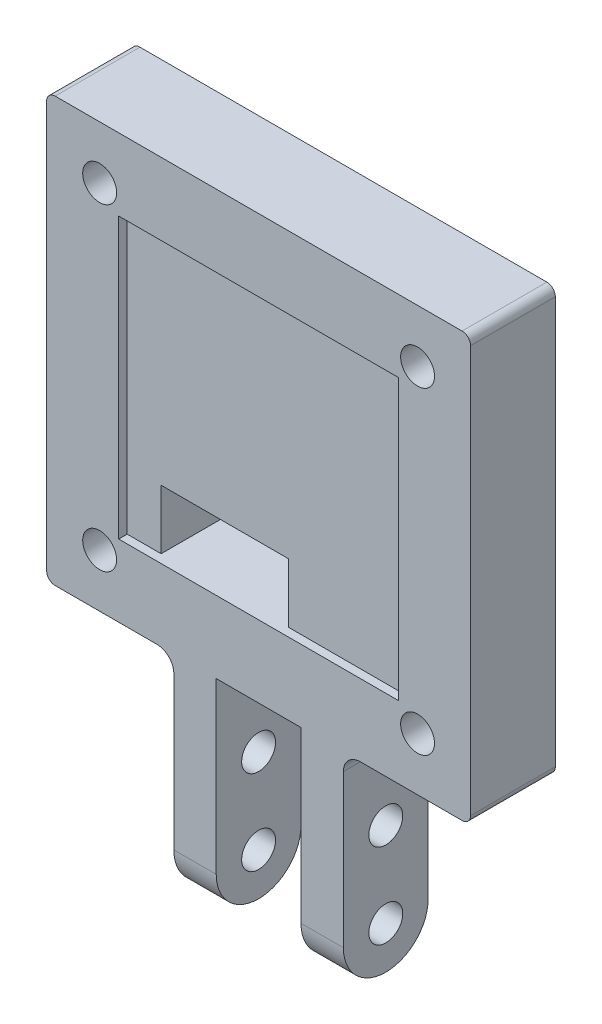
ISO-10303-21;
HEADER;
FILE_DESCRIPTION(('STEP AP214'),'2;1');
FILE_NAME('part.step','',(''),(''),'','','');
FILE_SCHEMA(('AUTOMOTIVE_DESIGN { 1 0 10303 214 1 1 1 1 }'));
ENDSEC;
DATA;
#1=APPLICATION_CONTEXT('core data for automotive mechanical design processes');
#2=APPLICATION_PROTOCOL_DEFINITION('international standard','automotive_design',2000,#1);
#3=PRODUCT_CONTEXT('',#1,'mechanical');
#4=PRODUCT('Part','Part','',(#3));
#5=PRODUCT_RELATED_PRODUCT_CATEGORY('part','',(#4));
#6=PRODUCT_DEFINITION_FORMATION('','',#4);
#7=PRODUCT_DEFINITION_CONTEXT('part definition',#1,'design');
#8=PRODUCT_DEFINITION('design','',#6,#7);
#9=PRODUCT_DEFINITION_SHAPE('','',#8);
#10=(LENGTH_UNIT() NAMED_UNIT(*) SI_UNIT(.MILLI.,.METRE.));
#11=(NAMED_UNIT(*) PLANE_ANGLE_UNIT() SI_UNIT($,.RADIAN.));
#12=(NAMED_UNIT(*) SI_UNIT($,.STERADIAN.) SOLID_ANGLE_UNIT());
#13=UNCERTAINTY_MEASURE_WITH_UNIT(LENGTH_MEASURE(1.E-05),#10,'distance_accuracy_value','');
#14=(GEOMETRIC_REPRESENTATION_CONTEXT(3) GLOBAL_UNCERTAINTY_ASSIGNED_CONTEXT((#13)) GLOBAL_UNIT_ASSIGNED_CONTEXT((#10,
#11,#12)) REPRESENTATION_CONTEXT('',''));
#15=CARTESIAN_POINT('',(0.,0.,0.));
#16=DIRECTION('',(0.,0.,1.));
#17=DIRECTION('',(1.,0.,0.));
#18=AXIS2_PLACEMENT_3D('',#15,#16,#17);
#19=CARTESIAN_POINT('',(0.,0.,9.));
#20=DIRECTION('',(0.,0.,-1.));
#21=DIRECTION('',(-1.,0.,0.));
#22=AXIS2_PLACEMENT_3D('',#19,#20,#21);
#23=PLANE('',#22);
#24=DIRECTION('',(0.,-1.,0.));
#25=VECTOR('',#24,1.);
#26=CARTESIAN_POINT('',(12.5,8.5,9.));
#27=LINE('',#26,#25);
#28=CARTESIAN_POINT('',(12.5,15.5,9.));
#29=VERTEX_POINT('',#28);
#30=CARTESIAN_POINT('',(12.5,8.5,9.));
#31=VERTEX_POINT('',#30);
#32=EDGE_CURVE('E235',#29,#31,#27,.T.);
#33=ORIENTED_EDGE('',*,*,#32,.F.);
#34=DIRECTION('',(-1.,0.,0.));
#35=VECTOR('',#34,1.);
#36=CARTESIAN_POINT('',(12.5,15.5,9.));
#37=LINE('',#36,#35);
#38=CARTESIAN_POINT('',(27.5,15.5,9.));
#39=VERTEX_POINT('',#38);
#40=EDGE_CURVE('E232',#39,#29,#37,.T.);
#41=ORIENTED_EDGE('',*,*,#40,.F.);
#42=DIRECTION('',(0.,1.,0.));
#43=VECTOR('',#42,1.);
#44=CARTESIAN_POINT('',(27.5,8.5,9.));
#45=LINE('',#44,#43);
#46=CARTESIAN_POINT('',(27.5,8.5,9.));
#47=VERTEX_POINT('',#46);
#48=EDGE_CURVE('E53',#47,#39,#45,.T.);
#49=ORIENTED_EDGE('',*,*,#48,.F.);
#50=DIRECTION('',(1.,0.,0.));
#51=VECTOR('',#50,1.);
#52=CARTESIAN_POINT('',(8.49999999999999,8.5,9.));
#53=LINE('',#52,#51);
#54=CARTESIAN_POINT('',(41.5,8.5,9.));
#55=VERTEX_POINT('',#54);
#56=EDGE_CURVE('E248',#47,#55,#53,.T.);
#57=ORIENTED_EDGE('',*,*,#56,.T.);
#58=DIRECTION('',(0.,1.,0.));
#59=VECTOR('',#58,1.);
#60=CARTESIAN_POINT('',(41.5,8.5,9.));
#61=LINE('',#60,#59);
#62=CARTESIAN_POINT('',(41.5,41.5,9.));
#63=VERTEX_POINT('',#62);
#64=EDGE_CURVE('E266',#55,#63,#61,.T.);
#65=ORIENTED_EDGE('',*,*,#64,.T.);
#66=DIRECTION('',(-1.,0.,0.));
#67=VECTOR('',#66,1.);
#68=CARTESIAN_POINT('',(8.49999999999999,41.5,9.));
#69=LINE('',#68,#67);
#70=CARTESIAN_POINT('',(8.49999999999999,41.5,9.));
#71=VERTEX_POINT('',#70);
#72=EDGE_CURVE('E479',#63,#71,#69,.T.);
#73=ORIENTED_EDGE('',*,*,#72,.T.);
#74=DIRECTION('',(0.,-1.,0.));
#75=VECTOR('',#74,1.);
#76=CARTESIAN_POINT('',(8.49999999999999,8.5,9.));
#77=LINE('',#76,#75);
#78=CARTESIAN_POINT('',(8.49999999999999,8.5,9.));
#79=VERTEX_POINT('',#78);
#80=EDGE_CURVE('E246',#71,#79,#77,.T.);
#81=ORIENTED_EDGE('',*,*,#80,.T.);
#82=EDGE_CURVE('E228',#79,#31,#53,.T.);
#83=ORIENTED_EDGE('',*,*,#82,.T.);
#84=EDGE_LOOP('',(#33,#41,#49,#57,#65,#73,#81,#83));
#85=FACE_BOUND('',#84,.T.);
#86=ADVANCED_FACE('F38',(#85),#23,.F.);
#87=CARTESIAN_POINT('',(0.,0.,10.));
#88=DIRECTION('',(0.,1.,0.));
#89=DIRECTION('',(0.,0.,1.));
#90=AXIS2_PLACEMENT_3D('',#87,#88,#89);
#91=PLANE('',#90);
#92=DIRECTION('',(0.,0.,-1.));
#93=VECTOR('',#92,1.);
#94=CARTESIAN_POINT('',(30.,0.,10.));
#95=LINE('',#94,#93);
#96=CARTESIAN_POINT('',(30.,0.,10.));
#97=VERTEX_POINT('',#96);
#98=CARTESIAN_POINT('',(30.,0.,0.));
#99=VERTEX_POINT('',#98);
#100=EDGE_CURVE('E310',#97,#99,#95,.T.);
#101=ORIENTED_EDGE('',*,*,#100,.F.);
#102=DIRECTION('',(1.,0.,0.));
#103=VECTOR('',#102,1.);
#104=CARTESIAN_POINT('',(0.,0.,10.));
#105=LINE('',#104,#103);
#106=CARTESIAN_POINT('',(20.,0.,10.));
#107=VERTEX_POINT('',#106);
#108=EDGE_CURVE('E347',#107,#97,#105,.T.);
#109=ORIENTED_EDGE('',*,*,#108,.F.);
#110=DIRECTION('',(0.,0.,1.));
#111=VECTOR('',#110,1.);
#112=CARTESIAN_POINT('',(20.,0.,0.));
#113=LINE('',#112,#111);
#114=CARTESIAN_POINT('',(20.,0.,0.));
#115=VERTEX_POINT('',#114);
#116=EDGE_CURVE('E324',#115,#107,#113,.T.);
#117=ORIENTED_EDGE('',*,*,#116,.F.);
#118=DIRECTION('',(1.,0.,0.));
#119=VECTOR('',#118,1.);
#120=CARTESIAN_POINT('',(0.,0.,0.));
#121=LINE('',#120,#119);
#122=EDGE_CURVE('E361',#115,#99,#121,.T.);
#123=ORIENTED_EDGE('',*,*,#122,.T.);
#124=EDGE_LOOP('',(#101,#109,#117,#123));
#125=FACE_BOUND('',#124,.T.);
#126=ADVANCED_FACE('F509',(#125),#91,.F.);
#127=CARTESIAN_POINT('',(37.,0.,10.));
#128=VERTEX_POINT('',#127);
#129=CARTESIAN_POINT('',(49.,0.,10.));
#130=VERTEX_POINT('',#129);
#131=EDGE_CURVE('E341',#128,#130,#105,.T.);
#132=ORIENTED_EDGE('',*,*,#131,.F.);
#133=DIRECTION('',(0.,0.,1.));
#134=VECTOR('',#133,1.);
#135=CARTESIAN_POINT('',(37.,0.,0.));
#136=LINE('',#135,#134);
#137=CARTESIAN_POINT('',(37.,0.,0.));
#138=VERTEX_POINT('',#137);
#139=EDGE_CURVE('E456',#128,#138,#136,.F.);
#140=ORIENTED_EDGE('',*,*,#139,.T.);
#141=CARTESIAN_POINT('',(49.,0.,0.));
#142=VERTEX_POINT('',#141);
#143=EDGE_CURVE('E356',#138,#142,#121,.T.);
#144=ORIENTED_EDGE('',*,*,#143,.T.);
#145=DIRECTION('',(0.,0.,-1.));
#146=VECTOR('',#145,1.);
#147=CARTESIAN_POINT('',(49.,0.,10.));
#148=LINE('',#147,#146);
#149=EDGE_CURVE('E420',#142,#130,#148,.F.);
#150=ORIENTED_EDGE('',*,*,#149,.T.);
#151=EDGE_LOOP('',(#132,#140,#144,#150));
#152=FACE_BOUND('',#151,.T.);
#153=ADVANCED_FACE('F516',(#152),#91,.F.);
#154=CARTESIAN_POINT('',(1.,0.,0.));
#155=VERTEX_POINT('',#154);
#156=CARTESIAN_POINT('',(13.,0.,0.));
#157=VERTEX_POINT('',#156);
#158=EDGE_CURVE('E357',#155,#157,#121,.T.);
#159=ORIENTED_EDGE('',*,*,#158,.T.);
#160=DIRECTION('',(0.,0.,-1.));
#161=VECTOR('',#160,1.);
#162=CARTESIAN_POINT('',(13.,0.,10.));
#163=LINE('',#162,#161);
#164=CARTESIAN_POINT('',(13.,0.,10.));
#165=VERTEX_POINT('',#164);
#166=EDGE_CURVE('E447',#157,#165,#163,.F.);
#167=ORIENTED_EDGE('',*,*,#166,.T.);
#168=CARTESIAN_POINT('',(1.,0.,10.));
#169=VERTEX_POINT('',#168);
#170=EDGE_CURVE('E343',#169,#165,#105,.T.);
#171=ORIENTED_EDGE('',*,*,#170,.F.);
#172=DIRECTION('',(0.,0.,-1.));
#173=VECTOR('',#172,1.);
#174=CARTESIAN_POINT('',(1.,0.,10.));
#175=LINE('',#174,#173);
#176=EDGE_CURVE('E431',#169,#155,#175,.T.);
#177=ORIENTED_EDGE('',*,*,#176,.T.);
#178=EDGE_LOOP('',(#159,#167,#171,#177));
#179=FACE_BOUND('',#178,.T.);
#180=ADVANCED_FACE('F519',(#179),#91,.F.);
#181=CARTESIAN_POINT('',(0.,50.,10.));
#182=DIRECTION('',(1.,0.,0.));
#183=DIRECTION('',(0.,0.,-1.));
#184=AXIS2_PLACEMENT_3D('',#181,#182,#183);
#185=PLANE('',#184);
#186=DIRECTION('',(0.,-1.,0.));
#187=VECTOR('',#186,1.);
#188=CARTESIAN_POINT('',(0.,50.,0.));
#189=LINE('',#188,#187);
#190=CARTESIAN_POINT('',(0.,49.,0.));
#191=VERTEX_POINT('',#190);
#192=CARTESIAN_POINT('',(0.,1.,0.));
#193=VERTEX_POINT('',#192);
#194=EDGE_CURVE('E337',#191,#193,#189,.T.);
#195=ORIENTED_EDGE('',*,*,#194,.T.);
#196=DIRECTION('',(0.,0.,-1.));
#197=VECTOR('',#196,1.);
#198=CARTESIAN_POINT('',(0.,1.,10.));
#199=LINE('',#198,#197);
#200=CARTESIAN_POINT('',(0.,1.,10.));
#201=VERTEX_POINT('',#200);
#202=EDGE_CURVE('E437',#193,#201,#199,.F.);
#203=ORIENTED_EDGE('',*,*,#202,.T.);
#204=DIRECTION('',(0.,-1.,0.));
#205=VECTOR('',#204,1.);
#206=CARTESIAN_POINT('',(0.,50.,10.));
#207=LINE('',#206,#205);
#208=CARTESIAN_POINT('',(0.,49.,10.));
#209=VERTEX_POINT('',#208);
#210=EDGE_CURVE('E338',#209,#201,#207,.T.);
#211=ORIENTED_EDGE('',*,*,#210,.F.);
#212=DIRECTION('',(0.,0.,-1.));
#213=VECTOR('',#212,1.);
#214=CARTESIAN_POINT('',(0.,49.,10.));
#215=LINE('',#214,#213);
#216=EDGE_CURVE('E434',#209,#191,#215,.T.);
#217=ORIENTED_EDGE('',*,*,#216,.T.);
#218=EDGE_LOOP('',(#195,#203,#211,#217));
#219=FACE_BOUND('',#218,.T.);
#220=ADVANCED_FACE('F769',(#219),#185,.F.);
#221=CARTESIAN_POINT('',(50.,0.,10.));
#222=DIRECTION('',(-1.,0.,0.));
#223=DIRECTION('',(0.,-1.,0.));
#224=AXIS2_PLACEMENT_3D('',#221,#222,#223);
#225=PLANE('',#224);
#226=DIRECTION('',(0.,1.,0.));
#227=VECTOR('',#226,1.);
#228=CARTESIAN_POINT('',(50.,0.,10.));
#229=LINE('',#228,#227);
#230=CARTESIAN_POINT('',(50.,1.,10.));
#231=VERTEX_POINT('',#230);
#232=CARTESIAN_POINT('',(50.,49.,10.));
#233=VERTEX_POINT('',#232);
#234=EDGE_CURVE('E346',#231,#233,#229,.T.);
#235=ORIENTED_EDGE('',*,*,#234,.F.);
#236=DIRECTION('',(0.,0.,-1.));
#237=VECTOR('',#236,1.);
#238=CARTESIAN_POINT('',(50.,1.,10.));
#239=LINE('',#238,#237);
#240=CARTESIAN_POINT('',(50.,1.,0.));
#241=VERTEX_POINT('',#240);
#242=EDGE_CURVE('E408',#231,#241,#239,.T.);
#243=ORIENTED_EDGE('',*,*,#242,.T.);
#244=DIRECTION('',(0.,1.,0.));
#245=VECTOR('',#244,1.);
#246=CARTESIAN_POINT('',(50.,0.,0.));
#247=LINE('',#246,#245);
#248=CARTESIAN_POINT('',(50.,49.,0.));
#249=VERTEX_POINT('',#248);
#250=EDGE_CURVE('E360',#241,#249,#247,.T.);
#251=ORIENTED_EDGE('',*,*,#250,.T.);
#252=DIRECTION('',(0.,0.,-1.));
#253=VECTOR('',#252,1.);
#254=CARTESIAN_POINT('',(50.,49.,10.));
#255=LINE('',#254,#253);
#256=EDGE_CURVE('E404',#249,#233,#255,.F.);
#257=ORIENTED_EDGE('',*,*,#256,.T.);
#258=EDGE_LOOP('',(#235,#243,#251,#257));
#259=FACE_BOUND('',#258,.T.);
#260=ADVANCED_FACE('F764',(#259),#225,.F.);
#261=CARTESIAN_POINT('',(50.,50.,10.));
#262=DIRECTION('',(0.,-1.,0.));
#263=DIRECTION('',(1.,0.,0.));
#264=AXIS2_PLACEMENT_3D('',#261,#262,#263);
#265=PLANE('',#264);
#266=DIRECTION('',(-1.,0.,0.));
#267=VECTOR('',#266,1.);
#268=CARTESIAN_POINT('',(50.,50.,0.));
#269=LINE('',#268,#267);
#270=CARTESIAN_POINT('',(49.,50.,0.));
#271=VERTEX_POINT('',#270);
#272=CARTESIAN_POINT('',(1.,50.,0.));
#273=VERTEX_POINT('',#272);
#274=EDGE_CURVE('E342',#271,#273,#269,.T.);
#275=ORIENTED_EDGE('',*,*,#274,.T.);
#276=DIRECTION('',(0.,0.,-1.));
#277=VECTOR('',#276,1.);
#278=CARTESIAN_POINT('',(1.,50.,10.));
#279=LINE('',#278,#277);
#280=CARTESIAN_POINT('',(1.,50.,10.));
#281=VERTEX_POINT('',#280);
#282=EDGE_CURVE('E442',#273,#281,#279,.F.);
#283=ORIENTED_EDGE('',*,*,#282,.T.);
#284=DIRECTION('',(-1.,0.,0.));
#285=VECTOR('',#284,1.);
#286=CARTESIAN_POINT('',(50.,50.,10.));
#287=LINE('',#286,#285);
#288=CARTESIAN_POINT('',(49.,50.,10.));
#289=VERTEX_POINT('',#288);
#290=EDGE_CURVE('E350',#289,#281,#287,.T.);
#291=ORIENTED_EDGE('',*,*,#290,.F.);
#292=DIRECTION('',(0.,0.,-1.));
#293=VECTOR('',#292,1.);
#294=CARTESIAN_POINT('',(49.,50.,10.));
#295=LINE('',#294,#293);
#296=EDGE_CURVE('E439',#289,#271,#295,.T.);
#297=ORIENTED_EDGE('',*,*,#296,.T.);
#298=EDGE_LOOP('',(#275,#283,#291,#297));
#299=FACE_BOUND('',#298,.T.);
#300=ADVANCED_FACE('F744',(#299),#265,.F.);
#301=CARTESIAN_POINT('',(0.,0.,10.));
#302=DIRECTION('',(0.,0.,1.));
#303=DIRECTION('',(1.,0.,0.));
#304=AXIS2_PLACEMENT_3D('',#301,#302,#303);
#305=PLANE('',#304);
#306=DIRECTION('',(0.,1.,0.));
#307=VECTOR('',#306,1.);
#308=CARTESIAN_POINT('',(41.5,8.5,10.));
#309=LINE('',#308,#307);
#310=CARTESIAN_POINT('',(41.5,8.5,10.));
#311=VERTEX_POINT('',#310);
#312=CARTESIAN_POINT('',(41.5,41.5,10.));
#313=VERTEX_POINT('',#312);
#314=EDGE_CURVE('E256',#311,#313,#309,.T.);
#315=ORIENTED_EDGE('',*,*,#314,.F.);
#316=DIRECTION('',(1.,0.,0.));
#317=VECTOR('',#316,1.);
#318=CARTESIAN_POINT('',(8.49999999999999,8.5,10.));
#319=LINE('',#318,#317);
#320=CARTESIAN_POINT('',(8.49999999999999,8.5,10.));
#321=VERTEX_POINT('',#320);
#322=EDGE_CURVE('E264',#321,#311,#319,.T.);
#323=ORIENTED_EDGE('',*,*,#322,.F.);
#324=DIRECTION('',(0.,-1.,0.));
#325=VECTOR('',#324,1.);
#326=CARTESIAN_POINT('',(8.49999999999999,8.5,10.));
#327=LINE('',#326,#325);
#328=CARTESIAN_POINT('',(8.49999999999999,41.5,10.));
#329=VERTEX_POINT('',#328);
#330=EDGE_CURVE('E261',#329,#321,#327,.T.);
#331=ORIENTED_EDGE('',*,*,#330,.F.);
#332=DIRECTION('',(-1.,0.,0.));
#333=VECTOR('',#332,1.);
#334=CARTESIAN_POINT('',(8.49999999999999,41.5,10.));
#335=LINE('',#334,#333);
#336=EDGE_CURVE('E258',#313,#329,#335,.T.);
#337=ORIENTED_EDGE('',*,*,#336,.F.);
#338=EDGE_LOOP('',(#315,#323,#331,#337));
#339=FACE_BOUND('',#338,.T.);
#340=CARTESIAN_POINT('',(43.75,6.25,10.));
#341=DIRECTION('',(0.,0.,1.));
#342=DIRECTION('',(1.,0.,0.));
#343=AXIS2_PLACEMENT_3D('',#340,#341,#342);
#344=CIRCLE('',#343,2.);
#345=CARTESIAN_POINT('',(45.75,6.25,10.));
#346=VERTEX_POINT('',#345);
#347=EDGE_CURVE('E297',#346,#346,#344,.T.);
#348=ORIENTED_EDGE('',*,*,#347,.F.);
#349=EDGE_LOOP('',(#348));
#350=FACE_BOUND('',#349,.T.);
#351=CARTESIAN_POINT('',(6.25,6.25,10.));
#352=DIRECTION('',(0.,0.,1.));
#353=DIRECTION('',(1.,0.,0.));
#354=AXIS2_PLACEMENT_3D('',#351,#352,#353);
#355=CIRCLE('',#354,2.);
#356=CARTESIAN_POINT('',(8.25,6.25,10.));
#357=VERTEX_POINT('',#356);
#358=EDGE_CURVE('E302',#357,#357,#355,.T.);
#359=ORIENTED_EDGE('',*,*,#358,.F.);
#360=EDGE_LOOP('',(#359));
#361=FACE_BOUND('',#360,.T.);
#362=CARTESIAN_POINT('',(6.25,43.75,10.));
#363=DIRECTION('',(0.,0.,1.));
#364=DIRECTION('',(1.,0.,0.));
#365=AXIS2_PLACEMENT_3D('',#362,#363,#364);
#366=CIRCLE('',#365,2.);
#367=CARTESIAN_POINT('',(8.25,43.75,10.));
#368=VERTEX_POINT('',#367);
#369=EDGE_CURVE('E298',#368,#368,#366,.T.);
#370=ORIENTED_EDGE('',*,*,#369,.F.);
#371=EDGE_LOOP('',(#370));
#372=FACE_BOUND('',#371,.T.);
#373=CARTESIAN_POINT('',(43.75,43.75,10.));
#374=DIRECTION('',(0.,0.,1.));
#375=DIRECTION('',(1.,0.,0.));
#376=AXIS2_PLACEMENT_3D('',#373,#374,#375);
#377=CIRCLE('',#376,2.);
#378=CARTESIAN_POINT('',(45.75,43.75,10.));
#379=VERTEX_POINT('',#378);
#380=EDGE_CURVE('E301',#379,#379,#377,.T.);
#381=ORIENTED_EDGE('',*,*,#380,.F.);
#382=EDGE_LOOP('',(#381));
#383=FACE_BOUND('',#382,.T.);
#384=DIRECTION('',(0.,1.,0.));
#385=VECTOR('',#384,1.);
#386=CARTESIAN_POINT('',(35.,-25.,10.));
#387=LINE('',#386,#385);
#388=CARTESIAN_POINT('',(35.,-20.,10.));
#389=VERTEX_POINT('',#388);
#390=CARTESIAN_POINT('',(35.,-2.,10.));
#391=VERTEX_POINT('',#390);
#392=EDGE_CURVE('E313',#389,#391,#387,.T.);
#393=ORIENTED_EDGE('',*,*,#392,.T.);
#394=CARTESIAN_POINT('',(37.,-2.,10.));
#395=DIRECTION('',(0.,0.,1.));
#396=DIRECTION('',(1.,0.,0.));
#397=AXIS2_PLACEMENT_3D('',#394,#395,#396);
#398=CIRCLE('',#397,2.);
#399=EDGE_CURVE('E458',#391,#128,#398,.F.);
#400=ORIENTED_EDGE('',*,*,#399,.T.);
#401=ORIENTED_EDGE('',*,*,#131,.T.);
#402=CARTESIAN_POINT('',(49.,1.,10.));
#403=DIRECTION('',(0.,0.,1.));
#404=DIRECTION('',(1.,0.,0.));
#405=AXIS2_PLACEMENT_3D('',#402,#403,#404);
#406=CIRCLE('',#405,1.);
#407=EDGE_CURVE('E429',#130,#231,#406,.T.);
#408=ORIENTED_EDGE('',*,*,#407,.T.);
#409=ORIENTED_EDGE('',*,*,#234,.T.);
#410=CARTESIAN_POINT('',(49.,49.,10.));
#411=DIRECTION('',(0.,0.,1.));
#412=DIRECTION('',(1.,0.,0.));
#413=AXIS2_PLACEMENT_3D('',#410,#411,#412);
#414=CIRCLE('',#413,1.);
#415=EDGE_CURVE('E423',#233,#289,#414,.T.);
#416=ORIENTED_EDGE('',*,*,#415,.T.);
#417=ORIENTED_EDGE('',*,*,#290,.T.);
#418=CARTESIAN_POINT('',(1.,49.,10.));
#419=DIRECTION('',(0.,0.,1.));
#420=DIRECTION('',(1.,0.,0.));
#421=AXIS2_PLACEMENT_3D('',#418,#419,#420);
#422=CIRCLE('',#421,1.);
#423=EDGE_CURVE('E425',#281,#209,#422,.T.);
#424=ORIENTED_EDGE('',*,*,#423,.T.);
#425=ORIENTED_EDGE('',*,*,#210,.T.);
#426=CARTESIAN_POINT('',(1.,1.,10.));
#427=DIRECTION('',(0.,0.,1.));
#428=DIRECTION('',(1.,0.,0.));
#429=AXIS2_PLACEMENT_3D('',#426,#427,#428);
#430=CIRCLE('',#429,1.);
#431=EDGE_CURVE('E427',#201,#169,#430,.T.);
#432=ORIENTED_EDGE('',*,*,#431,.T.);
#433=ORIENTED_EDGE('',*,*,#170,.T.);
#434=CARTESIAN_POINT('',(13.,-2.,10.));
#435=DIRECTION('',(0.,0.,1.));
#436=DIRECTION('',(1.,0.,0.));
#437=AXIS2_PLACEMENT_3D('',#434,#435,#436);
#438=CIRCLE('',#437,2.);
#439=CARTESIAN_POINT('',(15.,-2.,10.));
#440=VERTEX_POINT('',#439);
#441=EDGE_CURVE('E451',#165,#440,#438,.F.);
#442=ORIENTED_EDGE('',*,*,#441,.T.);
#443=DIRECTION('',(0.,1.,0.));
#444=VECTOR('',#443,1.);
#445=CARTESIAN_POINT('',(15.,-25.,10.));
#446=LINE('',#445,#444);
#447=CARTESIAN_POINT('',(15.,-20.,10.));
#448=VERTEX_POINT('',#447);
#449=EDGE_CURVE('E334',#448,#440,#446,.T.);
#450=ORIENTED_EDGE('',*,*,#449,.F.);
#451=DIRECTION('',(-1.,0.,0.));
#452=VECTOR('',#451,1.);
#453=CARTESIAN_POINT('',(0.,-20.,10.));
#454=LINE('',#453,#452);
#455=CARTESIAN_POINT('',(20.,-20.,10.));
#456=VERTEX_POINT('',#455);
#457=EDGE_CURVE('E389',#448,#456,#454,.F.);
#458=ORIENTED_EDGE('',*,*,#457,.T.);
#459=DIRECTION('',(0.,1.,0.));
#460=VECTOR('',#459,1.);
#461=CARTESIAN_POINT('',(20.,-25.,10.));
#462=LINE('',#461,#460);
#463=EDGE_CURVE('E327',#456,#107,#462,.T.);
#464=ORIENTED_EDGE('',*,*,#463,.T.);
#465=ORIENTED_EDGE('',*,*,#108,.T.);
#466=DIRECTION('',(0.,1.,0.));
#467=VECTOR('',#466,1.);
#468=CARTESIAN_POINT('',(30.,-25.,10.));
#469=LINE('',#468,#467);
#470=CARTESIAN_POINT('',(30.,-20.,10.));
#471=VERTEX_POINT('',#470);
#472=EDGE_CURVE('E322',#471,#97,#469,.T.);
#473=ORIENTED_EDGE('',*,*,#472,.F.);
#474=DIRECTION('',(-1.,0.,0.));
#475=VECTOR('',#474,1.);
#476=CARTESIAN_POINT('',(35.,-20.,10.));
#477=LINE('',#476,#475);
#478=EDGE_CURVE('E380',#471,#389,#477,.F.);
#479=ORIENTED_EDGE('',*,*,#478,.T.);
#480=EDGE_LOOP('',(#393,#400,#401,#408,#409,#416,#417,#424,#425,#432,#433,#442,#450,#458,#464,
#465,#473,#479));
#481=FACE_BOUND('',#480,.T.);
#482=ADVANCED_FACE('F492',(#339,#350,#361,#372,#383,#481),#305,.T.);
#483=CARTESIAN_POINT('',(0.,0.,0.));
#484=DIRECTION('',(0.,0.,1.));
#485=DIRECTION('',(1.,0.,0.));
#486=AXIS2_PLACEMENT_3D('',#483,#484,#485);
#487=PLANE('',#486);
#488=DIRECTION('',(-1.,0.,0.));
#489=VECTOR('',#488,1.);
#490=CARTESIAN_POINT('',(0.,15.5,0.));
#491=LINE('',#490,#489);
#492=CARTESIAN_POINT('',(27.5,15.5,0.));
#493=VERTEX_POINT('',#492);
#494=CARTESIAN_POINT('',(12.5,15.5,0.));
#495=VERTEX_POINT('',#494);
#496=EDGE_CURVE('E46',#493,#495,#491,.T.);
#497=ORIENTED_EDGE('',*,*,#496,.T.);
#498=DIRECTION('',(0.,-1.,0.));
#499=VECTOR('',#498,1.);
#500=CARTESIAN_POINT('',(12.5,0.,0.));
#501=LINE('',#500,#499);
#502=CARTESIAN_POINT('',(12.5,8.5,0.));
#503=VERTEX_POINT('',#502);
#504=EDGE_CURVE('E11',#495,#503,#501,.T.);
#505=ORIENTED_EDGE('',*,*,#504,.T.);
#506=DIRECTION('',(1.,0.,0.));
#507=VECTOR('',#506,1.);
#508=CARTESIAN_POINT('',(0.,8.5,0.));
#509=LINE('',#508,#507);
#510=CARTESIAN_POINT('',(27.5,8.5,0.));
#511=VERTEX_POINT('',#510);
#512=EDGE_CURVE('E230',#503,#511,#509,.T.);
#513=ORIENTED_EDGE('',*,*,#512,.T.);
#514=DIRECTION('',(0.,1.,0.));
#515=VECTOR('',#514,1.);
#516=CARTESIAN_POINT('',(27.5,0.,0.));
#517=LINE('',#516,#515);
#518=EDGE_CURVE('E463',#511,#493,#517,.T.);
#519=ORIENTED_EDGE('',*,*,#518,.T.);
#520=EDGE_LOOP('',(#497,#505,#513,#519));
#521=FACE_BOUND('',#520,.T.);
#522=CARTESIAN_POINT('',(43.75,6.25,0.));
#523=DIRECTION('',(0.,0.,1.));
#524=DIRECTION('',(1.,0.,0.));
#525=AXIS2_PLACEMENT_3D('',#522,#523,#524);
#526=CIRCLE('',#525,2.);
#527=CARTESIAN_POINT('',(45.75,6.25,0.));
#528=VERTEX_POINT('',#527);
#529=EDGE_CURVE('E314',#528,#528,#526,.T.);
#530=ORIENTED_EDGE('',*,*,#529,.T.);
#531=EDGE_LOOP('',(#530));
#532=FACE_BOUND('',#531,.T.);
#533=CARTESIAN_POINT('',(6.25,6.25,0.));
#534=DIRECTION('',(0.,0.,1.));
#535=DIRECTION('',(1.,0.,0.));
#536=AXIS2_PLACEMENT_3D('',#533,#534,#535);
#537=CIRCLE('',#536,2.);
#538=CARTESIAN_POINT('',(8.25,6.25,0.));
#539=VERTEX_POINT('',#538);
#540=EDGE_CURVE('E371',#539,#539,#537,.T.);
#541=ORIENTED_EDGE('',*,*,#540,.T.);
#542=EDGE_LOOP('',(#541));
#543=FACE_BOUND('',#542,.T.);
#544=CARTESIAN_POINT('',(6.25,43.75,0.));
#545=DIRECTION('',(0.,0.,1.));
#546=DIRECTION('',(1.,0.,0.));
#547=AXIS2_PLACEMENT_3D('',#544,#545,#546);
#548=CIRCLE('',#547,2.);
#549=CARTESIAN_POINT('',(8.25,43.75,0.));
#550=VERTEX_POINT('',#549);
#551=EDGE_CURVE('E368',#550,#550,#548,.T.);
#552=ORIENTED_EDGE('',*,*,#551,.T.);
#553=EDGE_LOOP('',(#552));
#554=FACE_BOUND('',#553,.T.);
#555=CARTESIAN_POINT('',(43.75,43.75,0.));
#556=DIRECTION('',(0.,0.,1.));
#557=DIRECTION('',(1.,0.,0.));
#558=AXIS2_PLACEMENT_3D('',#555,#556,#557);
#559=CIRCLE('',#558,2.);
#560=CARTESIAN_POINT('',(45.75,43.75,0.));
#561=VERTEX_POINT('',#560);
#562=EDGE_CURVE('E309',#561,#561,#559,.T.);
#563=ORIENTED_EDGE('',*,*,#562,.T.);
#564=EDGE_LOOP('',(#563));
#565=FACE_BOUND('',#564,.T.);
#566=ORIENTED_EDGE('',*,*,#250,.F.);
#567=CARTESIAN_POINT('',(49.,1.,0.));
#568=DIRECTION('',(0.,0.,1.));
#569=DIRECTION('',(1.,0.,0.));
#570=AXIS2_PLACEMENT_3D('',#567,#568,#569);
#571=CIRCLE('',#570,1.);
#572=EDGE_CURVE('E417',#241,#142,#571,.F.);
#573=ORIENTED_EDGE('',*,*,#572,.T.);
#574=ORIENTED_EDGE('',*,*,#143,.F.);
#575=CARTESIAN_POINT('',(37.,-2.,0.));
#576=DIRECTION('',(0.,0.,1.));
#577=DIRECTION('',(1.,0.,0.));
#578=AXIS2_PLACEMENT_3D('',#575,#576,#577);
#579=CIRCLE('',#578,2.);
#580=CARTESIAN_POINT('',(35.,-2.,0.));
#581=VERTEX_POINT('',#580);
#582=EDGE_CURVE('E460',#138,#581,#579,.T.);
#583=ORIENTED_EDGE('',*,*,#582,.T.);
#584=DIRECTION('',(0.,1.,0.));
#585=VECTOR('',#584,1.);
#586=CARTESIAN_POINT('',(35.,-25.,0.));
#587=LINE('',#586,#585);
#588=CARTESIAN_POINT('',(35.,-20.,0.));
#589=VERTEX_POINT('',#588);
#590=EDGE_CURVE('E317',#589,#581,#587,.T.);
#591=ORIENTED_EDGE('',*,*,#590,.F.);
#592=DIRECTION('',(1.,0.,0.));
#593=VECTOR('',#592,1.);
#594=CARTESIAN_POINT('',(0.,-20.,0.));
#595=LINE('',#594,#593);
#596=CARTESIAN_POINT('',(30.,-20.,0.));
#597=VERTEX_POINT('',#596);
#598=EDGE_CURVE('E396',#589,#597,#595,.F.);
#599=ORIENTED_EDGE('',*,*,#598,.T.);
#600=DIRECTION('',(0.,1.,0.));
#601=VECTOR('',#600,1.);
#602=CARTESIAN_POINT('',(30.,-25.,0.));
#603=LINE('',#602,#601);
#604=EDGE_CURVE('E320',#597,#99,#603,.T.);
#605=ORIENTED_EDGE('',*,*,#604,.T.);
#606=ORIENTED_EDGE('',*,*,#122,.F.);
#607=DIRECTION('',(0.,1.,0.));
#608=VECTOR('',#607,1.);
#609=CARTESIAN_POINT('',(20.,-25.,0.));
#610=LINE('',#609,#608);
#611=CARTESIAN_POINT('',(20.,-20.,0.));
#612=VERTEX_POINT('',#611);
#613=EDGE_CURVE('E329',#612,#115,#610,.T.);
#614=ORIENTED_EDGE('',*,*,#613,.F.);
#615=DIRECTION('',(1.,0.,0.));
#616=VECTOR('',#615,1.);
#617=CARTESIAN_POINT('',(15.,-20.,0.));
#618=LINE('',#617,#616);
#619=CARTESIAN_POINT('',(15.,-20.,0.));
#620=VERTEX_POINT('',#619);
#621=EDGE_CURVE('E398',#612,#620,#618,.F.);
#622=ORIENTED_EDGE('',*,*,#621,.T.);
#623=DIRECTION('',(0.,1.,0.));
#624=VECTOR('',#623,1.);
#625=CARTESIAN_POINT('',(15.,-25.,0.));
#626=LINE('',#625,#624);
#627=CARTESIAN_POINT('',(15.,-2.,0.));
#628=VERTEX_POINT('',#627);
#629=EDGE_CURVE('E331',#620,#628,#626,.T.);
#630=ORIENTED_EDGE('',*,*,#629,.T.);
#631=CARTESIAN_POINT('',(13.,-2.,0.));
#632=DIRECTION('',(0.,0.,1.));
#633=DIRECTION('',(1.,0.,0.));
#634=AXIS2_PLACEMENT_3D('',#631,#632,#633);
#635=CIRCLE('',#634,2.);
#636=EDGE_CURVE('E449',#628,#157,#635,.T.);
#637=ORIENTED_EDGE('',*,*,#636,.T.);
#638=ORIENTED_EDGE('',*,*,#158,.F.);
#639=CARTESIAN_POINT('',(1.,1.,0.));
#640=DIRECTION('',(0.,0.,1.));
#641=DIRECTION('',(1.,0.,0.));
#642=AXIS2_PLACEMENT_3D('',#639,#640,#641);
#643=CIRCLE('',#642,1.);
#644=EDGE_CURVE('E415',#155,#193,#643,.F.);
#645=ORIENTED_EDGE('',*,*,#644,.T.);
#646=ORIENTED_EDGE('',*,*,#194,.F.);
#647=CARTESIAN_POINT('',(1.,49.,0.));
#648=DIRECTION('',(0.,0.,1.));
#649=DIRECTION('',(1.,0.,0.));
#650=AXIS2_PLACEMENT_3D('',#647,#648,#649);
#651=CIRCLE('',#650,1.);
#652=EDGE_CURVE('E413',#191,#273,#651,.F.);
#653=ORIENTED_EDGE('',*,*,#652,.T.);
#654=ORIENTED_EDGE('',*,*,#274,.F.);
#655=CARTESIAN_POINT('',(49.,49.,0.));
#656=DIRECTION('',(0.,0.,1.));
#657=DIRECTION('',(1.,0.,0.));
#658=AXIS2_PLACEMENT_3D('',#655,#656,#657);
#659=CIRCLE('',#658,1.);
#660=EDGE_CURVE('E411',#271,#249,#659,.F.);
#661=ORIENTED_EDGE('',*,*,#660,.T.);
#662=EDGE_LOOP('',(#566,#573,#574,#583,#591,#599,#605,#606,#614,#622,#630,#637,#638,#645,#646,
#653,#654,#661));
#663=FACE_BOUND('',#662,.T.);
#664=ADVANCED_FACE('F467',(#521,#532,#543,#554,#565,#663),#487,.F.);
#665=CARTESIAN_POINT('',(15.,-25.,10.));
#666=DIRECTION('',(1.,0.,0.));
#667=DIRECTION('',(0.,0.,-1.));
#668=AXIS2_PLACEMENT_3D('',#665,#666,#667);
#669=PLANE('',#668);
#670=CARTESIAN_POINT('',(15.,-10.,5.));
#671=DIRECTION('',(1.,0.,0.));
#672=DIRECTION('',(0.,0.,-1.));
#673=AXIS2_PLACEMENT_3D('',#670,#671,#672);
#674=CIRCLE('',#673,2.);
#675=CARTESIAN_POINT('',(15.,-10.,3.));
#676=VERTEX_POINT('',#675);
#677=EDGE_CURVE('E294',#676,#676,#674,.T.);
#678=ORIENTED_EDGE('',*,*,#677,.T.);
#679=EDGE_LOOP('',(#678));
#680=FACE_BOUND('',#679,.T.);
#681=CARTESIAN_POINT('',(15.,-20.,5.));
#682=DIRECTION('',(1.,0.,0.));
#683=DIRECTION('',(0.,0.,-1.));
#684=AXIS2_PLACEMENT_3D('',#681,#682,#683);
#685=CIRCLE('',#684,2.);
#686=CARTESIAN_POINT('',(15.,-20.,3.));
#687=VERTEX_POINT('',#686);
#688=EDGE_CURVE('E285',#687,#687,#685,.T.);
#689=ORIENTED_EDGE('',*,*,#688,.T.);
#690=EDGE_LOOP('',(#689));
#691=FACE_BOUND('',#690,.T.);
#692=ORIENTED_EDGE('',*,*,#449,.T.);
#693=DIRECTION('',(0.,0.,-1.));
#694=VECTOR('',#693,1.);
#695=CARTESIAN_POINT('',(15.,-2.,0.));
#696=LINE('',#695,#694);
#697=EDGE_CURVE('E444',#440,#628,#696,.T.);
#698=ORIENTED_EDGE('',*,*,#697,.T.);
#699=ORIENTED_EDGE('',*,*,#629,.F.);
#700=CARTESIAN_POINT('',(15.,-20.,5.));
#701=DIRECTION('',(1.,0.,0.));
#702=DIRECTION('',(0.,0.,-1.));
#703=AXIS2_PLACEMENT_3D('',#700,#701,#702);
#704=CIRCLE('',#703,5.);
#705=CARTESIAN_POINT('',(15.,-25.,5.));
#706=VERTEX_POINT('',#705);
#707=EDGE_CURVE('E385',#620,#706,#704,.F.);
#708=ORIENTED_EDGE('',*,*,#707,.T.);
#709=CARTESIAN_POINT('',(15.,-20.,5.));
#710=DIRECTION('',(1.,0.,0.));
#711=DIRECTION('',(0.,0.,-1.));
#712=AXIS2_PLACEMENT_3D('',#709,#710,#711);
#713=CIRCLE('',#712,5.);
#714=EDGE_CURVE('E387',#706,#448,#713,.F.);
#715=ORIENTED_EDGE('',*,*,#714,.T.);
#716=EDGE_LOOP('',(#692,#698,#699,#708,#715));
#717=FACE_BOUND('',#716,.T.);
#718=ADVANCED_FACE('F557',(#680,#691,#717),#669,.F.);
#719=CARTESIAN_POINT('',(20.,-25.,0.));
#720=DIRECTION('',(-1.,0.,0.));
#721=DIRECTION('',(0.,0.,1.));
#722=AXIS2_PLACEMENT_3D('',#719,#720,#721);
#723=PLANE('',#722);
#724=CARTESIAN_POINT('',(20.,-10.,5.));
#725=DIRECTION('',(-1.,0.,0.));
#726=DIRECTION('',(0.,0.,1.));
#727=AXIS2_PLACEMENT_3D('',#724,#725,#726);
#728=CIRCLE('',#727,2.);
#729=CARTESIAN_POINT('',(20.,-10.,7.));
#730=VERTEX_POINT('',#729);
#731=EDGE_CURVE('E291',#730,#730,#728,.T.);
#732=ORIENTED_EDGE('',*,*,#731,.T.);
#733=EDGE_LOOP('',(#732));
#734=FACE_BOUND('',#733,.T.);
#735=CARTESIAN_POINT('',(20.,-20.,5.));
#736=DIRECTION('',(-1.,0.,0.));
#737=DIRECTION('',(0.,0.,1.));
#738=AXIS2_PLACEMENT_3D('',#735,#736,#737);
#739=CIRCLE('',#738,2.);
#740=CARTESIAN_POINT('',(20.,-20.,7.));
#741=VERTEX_POINT('',#740);
#742=EDGE_CURVE('E282',#741,#741,#739,.T.);
#743=ORIENTED_EDGE('',*,*,#742,.T.);
#744=EDGE_LOOP('',(#743));
#745=FACE_BOUND('',#744,.T.);
#746=ORIENTED_EDGE('',*,*,#463,.F.);
#747=CARTESIAN_POINT('',(20.,-20.,5.));
#748=DIRECTION('',(-1.,0.,0.));
#749=DIRECTION('',(0.,0.,1.));
#750=AXIS2_PLACEMENT_3D('',#747,#748,#749);
#751=CIRCLE('',#750,5.);
#752=CARTESIAN_POINT('',(20.,-25.,5.));
#753=VERTEX_POINT('',#752);
#754=EDGE_CURVE('E394',#456,#753,#751,.F.);
#755=ORIENTED_EDGE('',*,*,#754,.T.);
#756=CARTESIAN_POINT('',(20.,-20.,5.));
#757=DIRECTION('',(-1.,0.,0.));
#758=DIRECTION('',(0.,0.,1.));
#759=AXIS2_PLACEMENT_3D('',#756,#757,#758);
#760=CIRCLE('',#759,5.);
#761=EDGE_CURVE('E392',#753,#612,#760,.F.);
#762=ORIENTED_EDGE('',*,*,#761,.T.);
#763=ORIENTED_EDGE('',*,*,#613,.T.);
#764=ORIENTED_EDGE('',*,*,#116,.T.);
#765=EDGE_LOOP('',(#746,#755,#762,#763,#764));
#766=FACE_BOUND('',#765,.T.);
#767=ADVANCED_FACE('F574',(#734,#745,#766),#723,.F.);
#768=CARTESIAN_POINT('',(30.,-25.,10.));
#769=DIRECTION('',(1.,0.,0.));
#770=DIRECTION('',(0.,0.,-1.));
#771=AXIS2_PLACEMENT_3D('',#768,#769,#770);
#772=PLANE('',#771);
#773=CARTESIAN_POINT('',(30.,-10.,5.));
#774=DIRECTION('',(1.,0.,0.));
#775=DIRECTION('',(0.,0.,-1.));
#776=AXIS2_PLACEMENT_3D('',#773,#774,#775);
#777=CIRCLE('',#776,2.);
#778=CARTESIAN_POINT('',(30.,-10.,3.));
#779=VERTEX_POINT('',#778);
#780=EDGE_CURVE('E288',#779,#779,#777,.T.);
#781=ORIENTED_EDGE('',*,*,#780,.T.);
#782=EDGE_LOOP('',(#781));
#783=FACE_BOUND('',#782,.T.);
#784=CARTESIAN_POINT('',(30.,-20.,5.));
#785=DIRECTION('',(1.,0.,0.));
#786=DIRECTION('',(0.,0.,-1.));
#787=AXIS2_PLACEMENT_3D('',#784,#785,#786);
#788=CIRCLE('',#787,2.);
#789=CARTESIAN_POINT('',(30.,-20.,3.));
#790=VERTEX_POINT('',#789);
#791=EDGE_CURVE('E276',#790,#790,#788,.T.);
#792=ORIENTED_EDGE('',*,*,#791,.T.);
#793=EDGE_LOOP('',(#792));
#794=FACE_BOUND('',#793,.T.);
#795=ORIENTED_EDGE('',*,*,#604,.F.);
#796=CARTESIAN_POINT('',(30.,-20.,5.));
#797=DIRECTION('',(1.,0.,0.));
#798=DIRECTION('',(0.,0.,-1.));
#799=AXIS2_PLACEMENT_3D('',#796,#797,#798);
#800=CIRCLE('',#799,5.);
#801=CARTESIAN_POINT('',(30.,-25.,5.));
#802=VERTEX_POINT('',#801);
#803=EDGE_CURVE('E402',#597,#802,#800,.F.);
#804=ORIENTED_EDGE('',*,*,#803,.T.);
#805=CARTESIAN_POINT('',(30.,-20.,5.));
#806=DIRECTION('',(1.,0.,0.));
#807=DIRECTION('',(0.,0.,-1.));
#808=AXIS2_PLACEMENT_3D('',#805,#806,#807);
#809=CIRCLE('',#808,5.);
#810=EDGE_CURVE('E378',#802,#471,#809,.F.);
#811=ORIENTED_EDGE('',*,*,#810,.T.);
#812=ORIENTED_EDGE('',*,*,#472,.T.);
#813=ORIENTED_EDGE('',*,*,#100,.T.);
#814=EDGE_LOOP('',(#795,#804,#811,#812,#813));
#815=FACE_BOUND('',#814,.T.);
#816=ADVANCED_FACE('F583',(#783,#794,#815),#772,.F.);
#817=CARTESIAN_POINT('',(35.,-25.,10.));
#818=DIRECTION('',(-1.,0.,0.));
#819=DIRECTION('',(0.,0.,1.));
#820=AXIS2_PLACEMENT_3D('',#817,#818,#819);
#821=PLANE('',#820);
#822=CARTESIAN_POINT('',(35.,-10.,5.));
#823=DIRECTION('',(1.,0.,0.));
#824=DIRECTION('',(0.,0.,-1.));
#825=AXIS2_PLACEMENT_3D('',#822,#823,#824);
#826=CIRCLE('',#825,2.);
#827=CARTESIAN_POINT('',(35.,-10.,3.));
#828=VERTEX_POINT('',#827);
#829=EDGE_CURVE('E273',#828,#828,#826,.T.);
#830=ORIENTED_EDGE('',*,*,#829,.F.);
#831=EDGE_LOOP('',(#830));
#832=FACE_BOUND('',#831,.T.);
#833=CARTESIAN_POINT('',(35.,-20.,5.));
#834=DIRECTION('',(1.,0.,0.));
#835=DIRECTION('',(0.,0.,-1.));
#836=AXIS2_PLACEMENT_3D('',#833,#834,#835);
#837=CIRCLE('',#836,2.);
#838=CARTESIAN_POINT('',(35.,-20.,3.));
#839=VERTEX_POINT('',#838);
#840=EDGE_CURVE('E277',#839,#839,#837,.T.);
#841=ORIENTED_EDGE('',*,*,#840,.F.);
#842=EDGE_LOOP('',(#841));
#843=FACE_BOUND('',#842,.T.);
#844=ORIENTED_EDGE('',*,*,#590,.T.);
#845=DIRECTION('',(0.,0.,1.));
#846=VECTOR('',#845,1.);
#847=CARTESIAN_POINT('',(35.,-2.,10.));
#848=LINE('',#847,#846);
#849=EDGE_CURVE('E453',#581,#391,#848,.T.);
#850=ORIENTED_EDGE('',*,*,#849,.T.);
#851=ORIENTED_EDGE('',*,*,#392,.F.);
#852=CARTESIAN_POINT('',(35.,-20.,5.));
#853=DIRECTION('',(-1.,0.,0.));
#854=DIRECTION('',(0.,0.,1.));
#855=AXIS2_PLACEMENT_3D('',#852,#853,#854);
#856=CIRCLE('',#855,5.);
#857=CARTESIAN_POINT('',(35.,-25.,5.));
#858=VERTEX_POINT('',#857);
#859=EDGE_CURVE('E382',#389,#858,#856,.F.);
#860=ORIENTED_EDGE('',*,*,#859,.T.);
#861=CARTESIAN_POINT('',(35.,-20.,5.));
#862=DIRECTION('',(-1.,0.,0.));
#863=DIRECTION('',(0.,0.,1.));
#864=AXIS2_PLACEMENT_3D('',#861,#862,#863);
#865=CIRCLE('',#864,5.);
#866=EDGE_CURVE('E400',#858,#589,#865,.F.);
#867=ORIENTED_EDGE('',*,*,#866,.T.);
#868=EDGE_LOOP('',(#844,#850,#851,#860,#867));
#869=FACE_BOUND('',#868,.T.);
#870=ADVANCED_FACE('F592',(#832,#843,#869),#821,.F.);
#871=CARTESIAN_POINT('',(43.75,43.75,-15.));
#872=DIRECTION('',(0.,0.,1.));
#873=DIRECTION('',(1.,0.,0.));
#874=AXIS2_PLACEMENT_3D('',#871,#872,#873);
#875=CYLINDRICAL_SURFACE('',#874,2.);
#876=ORIENTED_EDGE('',*,*,#380,.T.);
#877=EDGE_LOOP('',(#876));
#878=FACE_BOUND('',#877,.T.);
#879=ORIENTED_EDGE('',*,*,#562,.F.);
#880=EDGE_LOOP('',(#879));
#881=FACE_BOUND('',#880,.T.);
#882=ADVANCED_FACE('F601',(#878,#881),#875,.F.);
#883=CARTESIAN_POINT('',(6.25,43.75,-15.));
#884=DIRECTION('',(0.,0.,1.));
#885=DIRECTION('',(1.,0.,0.));
#886=AXIS2_PLACEMENT_3D('',#883,#884,#885);
#887=CYLINDRICAL_SURFACE('',#886,2.);
#888=ORIENTED_EDGE('',*,*,#369,.T.);
#889=EDGE_LOOP('',(#888));
#890=FACE_BOUND('',#889,.T.);
#891=ORIENTED_EDGE('',*,*,#551,.F.);
#892=EDGE_LOOP('',(#891));
#893=FACE_BOUND('',#892,.T.);
#894=ADVANCED_FACE('F611',(#890,#893),#887,.F.);
#895=CARTESIAN_POINT('',(6.25,6.25,-15.));
#896=DIRECTION('',(0.,0.,1.));
#897=DIRECTION('',(1.,0.,0.));
#898=AXIS2_PLACEMENT_3D('',#895,#896,#897);
#899=CYLINDRICAL_SURFACE('',#898,2.);
#900=ORIENTED_EDGE('',*,*,#358,.T.);
#901=EDGE_LOOP('',(#900));
#902=FACE_BOUND('',#901,.T.);
#903=ORIENTED_EDGE('',*,*,#540,.F.);
#904=EDGE_LOOP('',(#903));
#905=FACE_BOUND('',#904,.T.);
#906=ADVANCED_FACE('F620',(#902,#905),#899,.F.);
#907=CARTESIAN_POINT('',(43.75,6.25,-15.));
#908=DIRECTION('',(0.,0.,1.));
#909=DIRECTION('',(1.,0.,0.));
#910=AXIS2_PLACEMENT_3D('',#907,#908,#909);
#911=CYLINDRICAL_SURFACE('',#910,2.);
#912=ORIENTED_EDGE('',*,*,#347,.T.);
#913=EDGE_LOOP('',(#912));
#914=FACE_BOUND('',#913,.T.);
#915=ORIENTED_EDGE('',*,*,#529,.F.);
#916=EDGE_LOOP('',(#915));
#917=FACE_BOUND('',#916,.T.);
#918=ADVANCED_FACE('F628',(#914,#917),#911,.F.);
#919=CARTESIAN_POINT('',(9.99999999999999,-20.,5.));
#920=DIRECTION('',(1.,0.,0.));
#921=DIRECTION('',(0.,0.,-1.));
#922=AXIS2_PLACEMENT_3D('',#919,#920,#921);
#923=CYLINDRICAL_SURFACE('',#922,2.);
#924=ORIENTED_EDGE('',*,*,#840,.T.);
#925=EDGE_LOOP('',(#924));
#926=FACE_BOUND('',#925,.T.);
#927=ORIENTED_EDGE('',*,*,#791,.F.);
#928=EDGE_LOOP('',(#927));
#929=FACE_BOUND('',#928,.T.);
#930=ADVANCED_FACE('F636',(#926,#929),#923,.F.);
#931=CARTESIAN_POINT('',(9.99999999999999,-10.,5.));
#932=DIRECTION('',(1.,0.,0.));
#933=DIRECTION('',(0.,0.,-1.));
#934=AXIS2_PLACEMENT_3D('',#931,#932,#933);
#935=CYLINDRICAL_SURFACE('',#934,2.);
#936=ORIENTED_EDGE('',*,*,#829,.T.);
#937=EDGE_LOOP('',(#936));
#938=FACE_BOUND('',#937,.T.);
#939=ORIENTED_EDGE('',*,*,#780,.F.);
#940=EDGE_LOOP('',(#939));
#941=FACE_BOUND('',#940,.T.);
#942=ADVANCED_FACE('F644',(#938,#941),#935,.F.);
#943=ORIENTED_EDGE('',*,*,#742,.F.);
#944=EDGE_LOOP('',(#943));
#945=FACE_BOUND('',#944,.T.);
#946=ORIENTED_EDGE('',*,*,#688,.F.);
#947=EDGE_LOOP('',(#946));
#948=FACE_BOUND('',#947,.T.);
#949=ADVANCED_FACE('F647',(#945,#948),#923,.F.);
#950=ORIENTED_EDGE('',*,*,#731,.F.);
#951=EDGE_LOOP('',(#950));
#952=FACE_BOUND('',#951,.T.);
#953=ORIENTED_EDGE('',*,*,#677,.F.);
#954=EDGE_LOOP('',(#953));
#955=FACE_BOUND('',#954,.T.);
#956=ADVANCED_FACE('F654',(#952,#955),#935,.F.);
#957=CARTESIAN_POINT('',(0.,-20.,5.));
#958=DIRECTION('',(1.,0.,0.));
#959=DIRECTION('',(0.,0.,-1.));
#960=AXIS2_PLACEMENT_3D('',#957,#958,#959);
#961=CYLINDRICAL_SURFACE('',#960,5.);
#962=ORIENTED_EDGE('',*,*,#859,.F.);
#963=ORIENTED_EDGE('',*,*,#478,.F.);
#964=ORIENTED_EDGE('',*,*,#810,.F.);
#965=DIRECTION('',(-1.,0.,0.));
#966=VECTOR('',#965,1.);
#967=CARTESIAN_POINT('',(30.,-25.,5.));
#968=LINE('',#967,#966);
#969=EDGE_CURVE('E353',#858,#802,#968,.T.);
#970=ORIENTED_EDGE('',*,*,#969,.F.);
#971=EDGE_LOOP('',(#962,#963,#964,#970));
#972=FACE_BOUND('',#971,.T.);
#973=ADVANCED_FACE('F665',(#972),#961,.T.);
#974=CARTESIAN_POINT('',(0.,-20.,5.));
#975=DIRECTION('',(-1.,0.,0.));
#976=DIRECTION('',(0.,0.,1.));
#977=AXIS2_PLACEMENT_3D('',#974,#975,#976);
#978=CYLINDRICAL_SURFACE('',#977,5.);
#979=ORIENTED_EDGE('',*,*,#621,.F.);
#980=ORIENTED_EDGE('',*,*,#761,.F.);
#981=DIRECTION('',(1.,0.,0.));
#982=VECTOR('',#981,1.);
#983=CARTESIAN_POINT('',(20.,-25.,5.));
#984=LINE('',#983,#982);
#985=EDGE_CURVE('E269',#706,#753,#984,.T.);
#986=ORIENTED_EDGE('',*,*,#985,.F.);
#987=ORIENTED_EDGE('',*,*,#707,.F.);
#988=EDGE_LOOP('',(#979,#980,#986,#987));
#989=FACE_BOUND('',#988,.T.);
#990=ADVANCED_FACE('F671',(#989),#978,.T.);
#991=CARTESIAN_POINT('',(0.,-20.,5.));
#992=DIRECTION('',(-1.,0.,0.));
#993=DIRECTION('',(0.,0.,1.));
#994=AXIS2_PLACEMENT_3D('',#991,#992,#993);
#995=CYLINDRICAL_SURFACE('',#994,5.);
#996=ORIENTED_EDGE('',*,*,#754,.F.);
#997=ORIENTED_EDGE('',*,*,#457,.F.);
#998=ORIENTED_EDGE('',*,*,#714,.F.);
#999=ORIENTED_EDGE('',*,*,#985,.T.);
#1000=EDGE_LOOP('',(#996,#997,#998,#999));
#1001=FACE_BOUND('',#1000,.T.);
#1002=ADVANCED_FACE('F679',(#1001),#995,.T.);
#1003=CARTESIAN_POINT('',(0.,-20.,5.));
#1004=DIRECTION('',(1.,0.,0.));
#1005=DIRECTION('',(0.,0.,-1.));
#1006=AXIS2_PLACEMENT_3D('',#1003,#1004,#1005);
#1007=CYLINDRICAL_SURFACE('',#1006,5.);
#1008=ORIENTED_EDGE('',*,*,#803,.F.);
#1009=ORIENTED_EDGE('',*,*,#598,.F.);
#1010=ORIENTED_EDGE('',*,*,#866,.F.);
#1011=ORIENTED_EDGE('',*,*,#969,.T.);
#1012=EDGE_LOOP('',(#1008,#1009,#1010,#1011));
#1013=FACE_BOUND('',#1012,.T.);
#1014=ADVANCED_FACE('F687',(#1013),#1007,.T.);
#1015=CARTESIAN_POINT('',(49.,1.,10.));
#1016=DIRECTION('',(0.,0.,-1.));
#1017=DIRECTION('',(-1.,0.,0.));
#1018=AXIS2_PLACEMENT_3D('',#1015,#1016,#1017);
#1019=CYLINDRICAL_SURFACE('',#1018,1.);
#1020=ORIENTED_EDGE('',*,*,#407,.F.);
#1021=ORIENTED_EDGE('',*,*,#149,.F.);
#1022=ORIENTED_EDGE('',*,*,#572,.F.);
#1023=ORIENTED_EDGE('',*,*,#242,.F.);
#1024=EDGE_LOOP('',(#1020,#1021,#1022,#1023));
#1025=FACE_BOUND('',#1024,.T.);
#1026=ADVANCED_FACE('F695',(#1025),#1019,.T.);
#1027=CARTESIAN_POINT('',(1.,1.,10.));
#1028=DIRECTION('',(0.,0.,-1.));
#1029=DIRECTION('',(-1.,0.,0.));
#1030=AXIS2_PLACEMENT_3D('',#1027,#1028,#1029);
#1031=CYLINDRICAL_SURFACE('',#1030,1.);
#1032=ORIENTED_EDGE('',*,*,#431,.F.);
#1033=ORIENTED_EDGE('',*,*,#202,.F.);
#1034=ORIENTED_EDGE('',*,*,#644,.F.);
#1035=ORIENTED_EDGE('',*,*,#176,.F.);
#1036=EDGE_LOOP('',(#1032,#1033,#1034,#1035));
#1037=FACE_BOUND('',#1036,.T.);
#1038=ADVANCED_FACE('F704',(#1037),#1031,.T.);
#1039=CARTESIAN_POINT('',(1.,49.,10.));
#1040=DIRECTION('',(0.,0.,-1.));
#1041=DIRECTION('',(-1.,0.,0.));
#1042=AXIS2_PLACEMENT_3D('',#1039,#1040,#1041);
#1043=CYLINDRICAL_SURFACE('',#1042,1.);
#1044=ORIENTED_EDGE('',*,*,#423,.F.);
#1045=ORIENTED_EDGE('',*,*,#282,.F.);
#1046=ORIENTED_EDGE('',*,*,#652,.F.);
#1047=ORIENTED_EDGE('',*,*,#216,.F.);
#1048=EDGE_LOOP('',(#1044,#1045,#1046,#1047));
#1049=FACE_BOUND('',#1048,.T.);
#1050=ADVANCED_FACE('F713',(#1049),#1043,.T.);
#1051=CARTESIAN_POINT('',(49.,49.,10.));
#1052=DIRECTION('',(0.,0.,-1.));
#1053=DIRECTION('',(-1.,0.,0.));
#1054=AXIS2_PLACEMENT_3D('',#1051,#1052,#1053);
#1055=CYLINDRICAL_SURFACE('',#1054,1.);
#1056=ORIENTED_EDGE('',*,*,#415,.F.);
#1057=ORIENTED_EDGE('',*,*,#256,.F.);
#1058=ORIENTED_EDGE('',*,*,#660,.F.);
#1059=ORIENTED_EDGE('',*,*,#296,.F.);
#1060=EDGE_LOOP('',(#1056,#1057,#1058,#1059));
#1061=FACE_BOUND('',#1060,.T.);
#1062=ADVANCED_FACE('F721',(#1061),#1055,.T.);
#1063=CARTESIAN_POINT('',(13.,-2.,10.));
#1064=DIRECTION('',(0.,0.,1.));
#1065=DIRECTION('',(1.,0.,0.));
#1066=AXIS2_PLACEMENT_3D('',#1063,#1064,#1065);
#1067=CYLINDRICAL_SURFACE('',#1066,2.);
#1068=ORIENTED_EDGE('',*,*,#441,.F.);
#1069=ORIENTED_EDGE('',*,*,#166,.F.);
#1070=ORIENTED_EDGE('',*,*,#636,.F.);
#1071=ORIENTED_EDGE('',*,*,#697,.F.);
#1072=EDGE_LOOP('',(#1068,#1069,#1070,#1071));
#1073=FACE_BOUND('',#1072,.T.);
#1074=ADVANCED_FACE('F504',(#1073),#1067,.F.);
#1075=CARTESIAN_POINT('',(37.,-2.,10.));
#1076=DIRECTION('',(0.,0.,-1.));
#1077=DIRECTION('',(-1.,0.,0.));
#1078=AXIS2_PLACEMENT_3D('',#1075,#1076,#1077);
#1079=CYLINDRICAL_SURFACE('',#1078,2.);
#1080=ORIENTED_EDGE('',*,*,#582,.F.);
#1081=ORIENTED_EDGE('',*,*,#139,.F.);
#1082=ORIENTED_EDGE('',*,*,#399,.F.);
#1083=ORIENTED_EDGE('',*,*,#849,.F.);
#1084=EDGE_LOOP('',(#1080,#1081,#1082,#1083));
#1085=FACE_BOUND('',#1084,.T.);
#1086=ADVANCED_FACE('F40',(#1085),#1079,.F.);
#1087=CARTESIAN_POINT('',(41.5,8.5,9.));
#1088=DIRECTION('',(1.,0.,0.));
#1089=DIRECTION('',(0.,1.,0.));
#1090=AXIS2_PLACEMENT_3D('',#1087,#1088,#1089);
#1091=PLANE('',#1090);
#1092=ORIENTED_EDGE('',*,*,#314,.T.);
#1093=DIRECTION('',(0.,0.,1.));
#1094=VECTOR('',#1093,1.);
#1095=CARTESIAN_POINT('',(41.5,41.5,9.));
#1096=LINE('',#1095,#1094);
#1097=EDGE_CURVE('E247',#63,#313,#1096,.T.);
#1098=ORIENTED_EDGE('',*,*,#1097,.F.);
#1099=ORIENTED_EDGE('',*,*,#64,.F.);
#1100=DIRECTION('',(0.,0.,1.));
#1101=VECTOR('',#1100,1.);
#1102=CARTESIAN_POINT('',(41.5,8.5,9.));
#1103=LINE('',#1102,#1101);
#1104=EDGE_CURVE('E267',#55,#311,#1103,.T.);
#1105=ORIENTED_EDGE('',*,*,#1104,.T.);
#1106=EDGE_LOOP('',(#1092,#1098,#1099,#1105));
#1107=FACE_BOUND('',#1106,.T.);
#1108=ADVANCED_FACE('F495',(#1107),#1091,.F.);
#1109=CARTESIAN_POINT('',(8.49999999999999,8.5,9.));
#1110=DIRECTION('',(0.,-1.,0.));
#1111=DIRECTION('',(0.,0.,-1.));
#1112=AXIS2_PLACEMENT_3D('',#1109,#1110,#1111);
#1113=PLANE('',#1112);
#1114=ORIENTED_EDGE('',*,*,#322,.T.);
#1115=ORIENTED_EDGE('',*,*,#1104,.F.);
#1116=ORIENTED_EDGE('',*,*,#56,.F.);
#1117=DIRECTION('',(0.,0.,1.));
#1118=VECTOR('',#1117,1.);
#1119=CARTESIAN_POINT('',(27.5,8.5,-7.));
#1120=LINE('',#1119,#1118);
#1121=EDGE_CURVE('E60',#511,#47,#1120,.T.);
#1122=ORIENTED_EDGE('',*,*,#1121,.F.);
#1123=ORIENTED_EDGE('',*,*,#512,.F.);
#1124=DIRECTION('',(0.,0.,1.));
#1125=VECTOR('',#1124,1.);
#1126=CARTESIAN_POINT('',(12.5,8.5,-7.));
#1127=LINE('',#1126,#1125);
#1128=EDGE_CURVE('E223',#503,#31,#1127,.T.);
#1129=ORIENTED_EDGE('',*,*,#1128,.T.);
#1130=ORIENTED_EDGE('',*,*,#82,.F.);
#1131=DIRECTION('',(0.,0.,1.));
#1132=VECTOR('',#1131,1.);
#1133=CARTESIAN_POINT('',(8.49999999999999,8.5,9.));
#1134=LINE('',#1133,#1132);
#1135=EDGE_CURVE('E270',#79,#321,#1134,.T.);
#1136=ORIENTED_EDGE('',*,*,#1135,.T.);
#1137=EDGE_LOOP('',(#1114,#1115,#1116,#1122,#1123,#1129,#1130,#1136));
#1138=FACE_BOUND('',#1137,.T.);
#1139=ADVANCED_FACE('F226',(#1138),#1113,.F.);
#1140=CARTESIAN_POINT('',(8.49999999999999,8.5,9.));
#1141=DIRECTION('',(-1.,0.,0.));
#1142=DIRECTION('',(0.,0.,1.));
#1143=AXIS2_PLACEMENT_3D('',#1140,#1141,#1142);
#1144=PLANE('',#1143);
#1145=ORIENTED_EDGE('',*,*,#330,.T.);
#1146=ORIENTED_EDGE('',*,*,#1135,.F.);
#1147=ORIENTED_EDGE('',*,*,#80,.F.);
#1148=DIRECTION('',(0.,0.,1.));
#1149=VECTOR('',#1148,1.);
#1150=CARTESIAN_POINT('',(8.49999999999999,41.5,9.));
#1151=LINE('',#1150,#1149);
#1152=EDGE_CURVE('E251',#71,#329,#1151,.T.);
#1153=ORIENTED_EDGE('',*,*,#1152,.T.);
#1154=EDGE_LOOP('',(#1145,#1146,#1147,#1153));
#1155=FACE_BOUND('',#1154,.T.);
#1156=ADVANCED_FACE('F487',(#1155),#1144,.F.);
#1157=CARTESIAN_POINT('',(8.49999999999999,41.5,9.));
#1158=DIRECTION('',(0.,1.,0.));
#1159=DIRECTION('',(0.,0.,1.));
#1160=AXIS2_PLACEMENT_3D('',#1157,#1158,#1159);
#1161=PLANE('',#1160);
#1162=ORIENTED_EDGE('',*,*,#336,.T.);
#1163=ORIENTED_EDGE('',*,*,#1152,.F.);
#1164=ORIENTED_EDGE('',*,*,#72,.F.);
#1165=ORIENTED_EDGE('',*,*,#1097,.T.);
#1166=EDGE_LOOP('',(#1162,#1163,#1164,#1165));
#1167=FACE_BOUND('',#1166,.T.);
#1168=ADVANCED_FACE('F483',(#1167),#1161,.F.);
#1169=CARTESIAN_POINT('',(12.5,8.5,-7.));
#1170=DIRECTION('',(-1.,0.,0.));
#1171=DIRECTION('',(0.,0.,1.));
#1172=AXIS2_PLACEMENT_3D('',#1169,#1170,#1171);
#1173=PLANE('',#1172);
#1174=DIRECTION('',(0.,0.,1.));
#1175=VECTOR('',#1174,1.);
#1176=CARTESIAN_POINT('',(12.5,15.5,-7.));
#1177=LINE('',#1176,#1175);
#1178=EDGE_CURVE('E238',#495,#29,#1177,.T.);
#1179=ORIENTED_EDGE('',*,*,#1178,.T.);
#1180=ORIENTED_EDGE('',*,*,#32,.T.);
#1181=ORIENTED_EDGE('',*,*,#1128,.F.);
#1182=ORIENTED_EDGE('',*,*,#504,.F.);
#1183=EDGE_LOOP('',(#1179,#1180,#1181,#1182));
#1184=FACE_BOUND('',#1183,.T.);
#1185=ADVANCED_FACE('F236',(#1184),#1173,.F.);
#1186=CARTESIAN_POINT('',(12.5,15.5,-7.));
#1187=DIRECTION('',(0.,1.,0.));
#1188=DIRECTION('',(0.,0.,1.));
#1189=AXIS2_PLACEMENT_3D('',#1186,#1187,#1188);
#1190=PLANE('',#1189);
#1191=DIRECTION('',(0.,0.,1.));
#1192=VECTOR('',#1191,1.);
#1193=CARTESIAN_POINT('',(27.5,15.5,-7.));
#1194=LINE('',#1193,#1192);
#1195=EDGE_CURVE('E471',#493,#39,#1194,.T.);
#1196=ORIENTED_EDGE('',*,*,#1195,.T.);
#1197=ORIENTED_EDGE('',*,*,#40,.T.);
#1198=ORIENTED_EDGE('',*,*,#1178,.F.);
#1199=ORIENTED_EDGE('',*,*,#496,.F.);
#1200=EDGE_LOOP('',(#1196,#1197,#1198,#1199));
#1201=FACE_BOUND('',#1200,.T.);
#1202=ADVANCED_FACE('F470',(#1201),#1190,.F.);
#1203=CARTESIAN_POINT('',(27.5,8.5,-7.));
#1204=DIRECTION('',(1.,0.,0.));
#1205=DIRECTION('',(0.,0.,-1.));
#1206=AXIS2_PLACEMENT_3D('',#1203,#1204,#1205);
#1207=PLANE('',#1206);
#1208=ORIENTED_EDGE('',*,*,#1121,.T.);
#1209=ORIENTED_EDGE('',*,*,#48,.T.);
#1210=ORIENTED_EDGE('',*,*,#1195,.F.);
#1211=ORIENTED_EDGE('',*,*,#518,.F.);
#1212=EDGE_LOOP('',(#1208,#1209,#1210,#1211));
#1213=FACE_BOUND('',#1212,.T.);
#1214=ADVANCED_FACE('F472',(#1213),#1207,.F.);
#1215=CLOSED_SHELL('',(#86,#126,#153,#180,#220,#260,#300,#482,#664,#718,#767,#816,#870,#882,
#894,#906,#918,#930,#942,#949,#956,#973,#990,#1002,#1014,#1026,#1038,#1050,#1062,#1074,#1086,
#1108,#1139,#1156,#1168,#1185,#1202,#1214));
#1216=MANIFOLD_SOLID_BREP('B2',#1215);
#1217=ADVANCED_BREP_SHAPE_REPRESENTATION('',(#18,#1216),#14);
#1218=SHAPE_DEFINITION_REPRESENTATION(#9,#1217);
ENDSEC;
END-ISO-10303-21;
